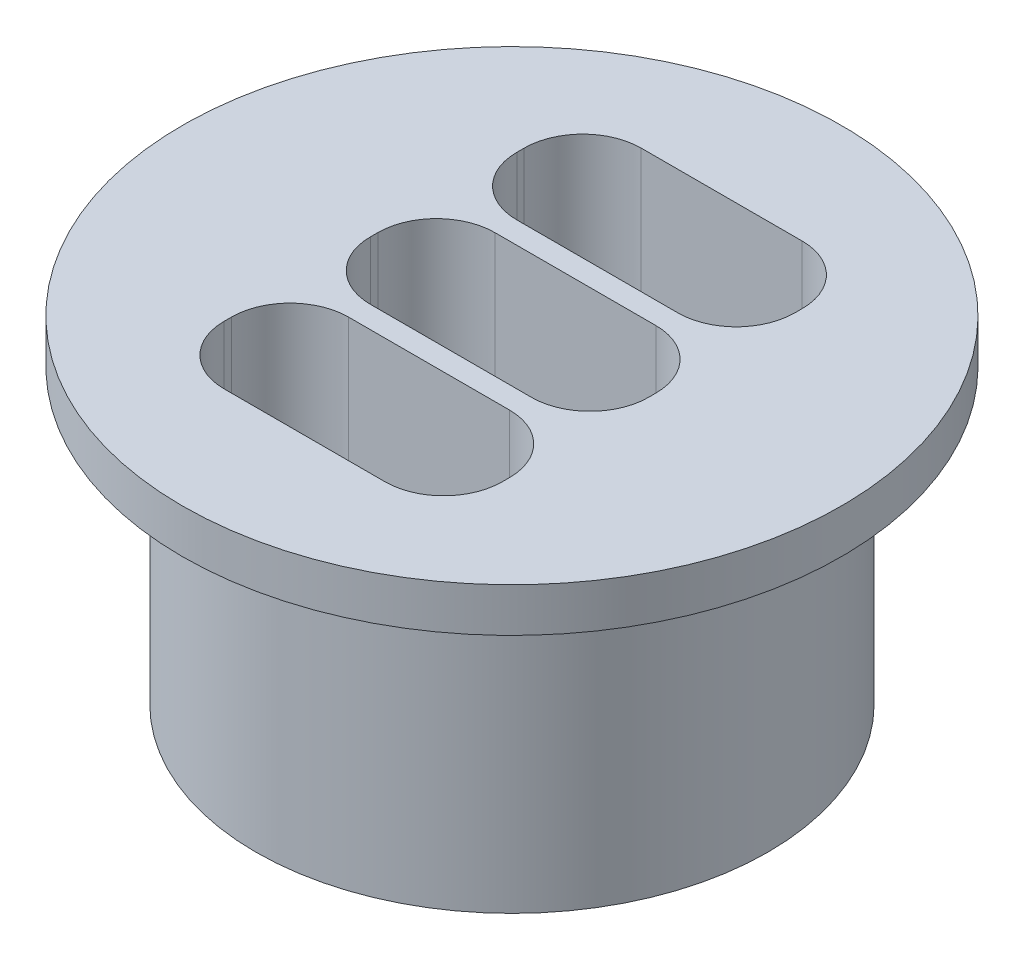
ISO-10303-21;
HEADER;
FILE_DESCRIPTION(('STEP AP214'),'2;1');
FILE_NAME('part.step','',(''),(''),'','','');
FILE_SCHEMA(('AUTOMOTIVE_DESIGN { 1 0 10303 214 1 1 1 1 }'));
ENDSEC;
DATA;
#1=APPLICATION_CONTEXT('core data for automotive mechanical design processes');
#2=APPLICATION_PROTOCOL_DEFINITION('international standard','automotive_design',2000,#1);
#3=PRODUCT_CONTEXT('',#1,'mechanical');
#4=PRODUCT('Part','Part','',(#3));
#5=PRODUCT_RELATED_PRODUCT_CATEGORY('part','',(#4));
#6=PRODUCT_DEFINITION_FORMATION('','',#4);
#7=PRODUCT_DEFINITION_CONTEXT('part definition',#1,'design');
#8=PRODUCT_DEFINITION('design','',#6,#7);
#9=PRODUCT_DEFINITION_SHAPE('','',#8);
#10=(LENGTH_UNIT() NAMED_UNIT(*) SI_UNIT(.MILLI.,.METRE.));
#11=(NAMED_UNIT(*) PLANE_ANGLE_UNIT() SI_UNIT($,.RADIAN.));
#12=(NAMED_UNIT(*) SI_UNIT($,.STERADIAN.) SOLID_ANGLE_UNIT());
#13=UNCERTAINTY_MEASURE_WITH_UNIT(LENGTH_MEASURE(1.E-05),#10,'distance_accuracy_value','');
#14=(GEOMETRIC_REPRESENTATION_CONTEXT(3) GLOBAL_UNCERTAINTY_ASSIGNED_CONTEXT((#13)) GLOBAL_UNIT_ASSIGNED_CONTEXT((#10,
#11,#12)) REPRESENTATION_CONTEXT('',''));
#15=CARTESIAN_POINT('',(0.,0.,0.));
#16=DIRECTION('',(0.,0.,1.));
#17=DIRECTION('',(1.,0.,0.));
#18=AXIS2_PLACEMENT_3D('',#15,#16,#17);
#19=CARTESIAN_POINT('',(0.,20.,0.));
#20=DIRECTION('',(0.,-1.,0.));
#21=DIRECTION('',(0.,0.,-1.));
#22=AXIS2_PLACEMENT_3D('',#19,#20,#21);
#23=CYLINDRICAL_SURFACE('',#22,17.5);
#24=CARTESIAN_POINT('',(0.,20.,0.));
#25=DIRECTION('',(0.,1.,0.));
#26=DIRECTION('',(0.,0.,1.));
#27=AXIS2_PLACEMENT_3D('',#24,#25,#26);
#28=CIRCLE('',#27,17.5);
#29=CARTESIAN_POINT('',(0.,20.,17.5));
#30=VERTEX_POINT('',#29);
#31=EDGE_CURVE('E246',#30,#30,#28,.T.);
#32=ORIENTED_EDGE('',*,*,#31,.F.);
#33=EDGE_LOOP('',(#32));
#34=FACE_BOUND('',#33,.T.);
#35=CARTESIAN_POINT('',(0.,0.,0.));
#36=DIRECTION('',(0.,1.,0.));
#37=DIRECTION('',(0.,0.,1.));
#38=AXIS2_PLACEMENT_3D('',#35,#36,#37);
#39=CIRCLE('',#38,17.5);
#40=CARTESIAN_POINT('',(0.,0.,17.5));
#41=VERTEX_POINT('',#40);
#42=EDGE_CURVE('E250',#41,#41,#39,.T.);
#43=ORIENTED_EDGE('',*,*,#42,.T.);
#44=EDGE_LOOP('',(#43));
#45=FACE_BOUND('',#44,.T.);
#46=ADVANCED_FACE('F39',(#34,#45),#23,.T.);
#47=CARTESIAN_POINT('',(0.,0.,0.));
#48=DIRECTION('',(0.,1.,0.));
#49=DIRECTION('',(0.,0.,1.));
#50=AXIS2_PLACEMENT_3D('',#47,#48,#49);
#51=PLANE('',#50);
#52=DIRECTION('',(0.,0.,1.));
#53=VECTOR('',#52,1.);
#54=CARTESIAN_POINT('',(-9.5,0.,-14.3338110373272));
#55=LINE('',#54,#53);
#56=CARTESIAN_POINT('',(-9.5,0.,-10.3338110373272));
#57=VERTEX_POINT('',#56);
#58=CARTESIAN_POINT('',(-9.5,0.,-9.83381103732719));
#59=VERTEX_POINT('',#58);
#60=EDGE_CURVE('E421',#57,#59,#55,.T.);
#61=ORIENTED_EDGE('',*,*,#60,.T.);
#62=CARTESIAN_POINT('',(-5.5,0.,-9.83381103732719));
#63=DIRECTION('',(0.,1.,0.));
#64=DIRECTION('',(0.,0.,1.));
#65=AXIS2_PLACEMENT_3D('',#62,#63,#64);
#66=CIRCLE('',#65,4.);
#67=CARTESIAN_POINT('',(-5.5,0.,-5.83381103732719));
#68=VERTEX_POINT('',#67);
#69=EDGE_CURVE('E62',#59,#68,#66,.T.);
#70=ORIENTED_EDGE('',*,*,#69,.T.);
#71=DIRECTION('',(1.,0.,0.));
#72=VECTOR('',#71,1.);
#73=CARTESIAN_POINT('',(-9.5,0.,-5.83381103732719));
#74=LINE('',#73,#72);
#75=CARTESIAN_POINT('',(5.5,0.,-5.83381103732719));
#76=VERTEX_POINT('',#75);
#77=EDGE_CURVE('E254',#68,#76,#74,.T.);
#78=ORIENTED_EDGE('',*,*,#77,.T.);
#79=CARTESIAN_POINT('',(5.5,0.,-9.83381103732719));
#80=DIRECTION('',(0.,1.,0.));
#81=DIRECTION('',(0.,0.,1.));
#82=AXIS2_PLACEMENT_3D('',#79,#80,#81);
#83=CIRCLE('',#82,4.);
#84=CARTESIAN_POINT('',(9.5,0.,-9.83381103732719));
#85=VERTEX_POINT('',#84);
#86=EDGE_CURVE('E382',#76,#85,#83,.T.);
#87=ORIENTED_EDGE('',*,*,#86,.T.);
#88=DIRECTION('',(0.,0.,-1.));
#89=VECTOR('',#88,1.);
#90=CARTESIAN_POINT('',(9.5,0.,-14.3338110373272));
#91=LINE('',#90,#89);
#92=CARTESIAN_POINT('',(9.5,0.,-10.3338110373272));
#93=VERTEX_POINT('',#92);
#94=EDGE_CURVE('E416',#85,#93,#91,.T.);
#95=ORIENTED_EDGE('',*,*,#94,.T.);
#96=CARTESIAN_POINT('',(5.5,0.,-10.3338110373272));
#97=DIRECTION('',(0.,1.,0.));
#98=DIRECTION('',(0.,0.,1.));
#99=AXIS2_PLACEMENT_3D('',#96,#97,#98);
#100=CIRCLE('',#99,4.);
#101=CARTESIAN_POINT('',(5.5,0.,-14.3338110373272));
#102=VERTEX_POINT('',#101);
#103=EDGE_CURVE('E11',#93,#102,#100,.T.);
#104=ORIENTED_EDGE('',*,*,#103,.T.);
#105=DIRECTION('',(-1.,0.,0.));
#106=VECTOR('',#105,1.);
#107=CARTESIAN_POINT('',(-9.5,0.,-14.3338110373272));
#108=LINE('',#107,#106);
#109=CARTESIAN_POINT('',(-5.5,0.,-14.3338110373272));
#110=VERTEX_POINT('',#109);
#111=EDGE_CURVE('E414',#102,#110,#108,.T.);
#112=ORIENTED_EDGE('',*,*,#111,.T.);
#113=CARTESIAN_POINT('',(-5.5,0.,-10.3338110373272));
#114=DIRECTION('',(0.,1.,0.));
#115=DIRECTION('',(0.,0.,1.));
#116=AXIS2_PLACEMENT_3D('',#113,#114,#115);
#117=CIRCLE('',#116,4.);
#118=EDGE_CURVE('E376',#110,#57,#117,.T.);
#119=ORIENTED_EDGE('',*,*,#118,.T.);
#120=EDGE_LOOP('',(#61,#70,#78,#87,#95,#104,#112,#119));
#121=FACE_BOUND('',#120,.T.);
#122=DIRECTION('',(-1.,0.,0.));
#123=VECTOR('',#122,1.);
#124=CARTESIAN_POINT('',(-9.4999999999999,0.,-4.33381103732719));
#125=LINE('',#124,#123);
#126=CARTESIAN_POINT('',(5.50000000000011,0.,-4.33381103732719));
#127=VERTEX_POINT('',#126);
#128=CARTESIAN_POINT('',(-5.49999999999989,0.,-4.33381103732719));
#129=VERTEX_POINT('',#128);
#130=EDGE_CURVE('E449',#127,#129,#125,.T.);
#131=ORIENTED_EDGE('',*,*,#130,.T.);
#132=CARTESIAN_POINT('',(-5.49999999999989,0.,-0.333811037327188));
#133=DIRECTION('',(0.,1.,0.));
#134=DIRECTION('',(0.,0.,1.));
#135=AXIS2_PLACEMENT_3D('',#132,#133,#134);
#136=CIRCLE('',#135,4.);
#137=CARTESIAN_POINT('',(-9.49999999999989,0.,-0.333811037327186));
#138=VERTEX_POINT('',#137);
#139=EDGE_CURVE('E337',#129,#138,#136,.T.);
#140=ORIENTED_EDGE('',*,*,#139,.T.);
#141=DIRECTION('',(0.,0.,1.));
#142=VECTOR('',#141,1.);
#143=CARTESIAN_POINT('',(-9.4999999999999,0.,-4.33381103732719));
#144=LINE('',#143,#142);
#145=CARTESIAN_POINT('',(-9.49999999999989,0.,0.166188962672814));
#146=VERTEX_POINT('',#145);
#147=EDGE_CURVE('E407',#138,#146,#144,.T.);
#148=ORIENTED_EDGE('',*,*,#147,.T.);
#149=CARTESIAN_POINT('',(-5.49999999999989,0.,0.166188962672812));
#150=DIRECTION('',(0.,1.,0.));
#151=DIRECTION('',(0.,0.,1.));
#152=AXIS2_PLACEMENT_3D('',#149,#150,#151);
#153=CIRCLE('',#152,4.);
#154=CARTESIAN_POINT('',(-5.49999999999989,0.,4.16618896267281));
#155=VERTEX_POINT('',#154);
#156=EDGE_CURVE('E331',#146,#155,#153,.T.);
#157=ORIENTED_EDGE('',*,*,#156,.T.);
#158=DIRECTION('',(1.,0.,0.));
#159=VECTOR('',#158,1.);
#160=CARTESIAN_POINT('',(-9.49999999999989,0.,4.16618896267281));
#161=LINE('',#160,#159);
#162=CARTESIAN_POINT('',(5.50000000000011,0.,4.16618896267281));
#163=VERTEX_POINT('',#162);
#164=EDGE_CURVE('E440',#155,#163,#161,.T.);
#165=ORIENTED_EDGE('',*,*,#164,.T.);
#166=CARTESIAN_POINT('',(5.50000000000011,0.,0.166188962672812));
#167=DIRECTION('',(0.,1.,0.));
#168=DIRECTION('',(0.,0.,1.));
#169=AXIS2_PLACEMENT_3D('',#166,#167,#168);
#170=CIRCLE('',#169,4.);
#171=CARTESIAN_POINT('',(9.5000000000001,0.,0.166188962672811));
#172=VERTEX_POINT('',#171);
#173=EDGE_CURVE('E325',#163,#172,#170,.T.);
#174=ORIENTED_EDGE('',*,*,#173,.T.);
#175=DIRECTION('',(0.,0.,-1.));
#176=VECTOR('',#175,1.);
#177=CARTESIAN_POINT('',(9.5000000000001,0.,-4.33381103732719));
#178=LINE('',#177,#176);
#179=CARTESIAN_POINT('',(9.5000000000001,0.,-0.33381103732719));
#180=VERTEX_POINT('',#179);
#181=EDGE_CURVE('E444',#172,#180,#178,.T.);
#182=ORIENTED_EDGE('',*,*,#181,.T.);
#183=CARTESIAN_POINT('',(5.50000000000011,0.,-0.333811037327188));
#184=DIRECTION('',(0.,1.,0.));
#185=DIRECTION('',(0.,0.,1.));
#186=AXIS2_PLACEMENT_3D('',#183,#184,#185);
#187=CIRCLE('',#186,4.);
#188=EDGE_CURVE('E343',#180,#127,#187,.T.);
#189=ORIENTED_EDGE('',*,*,#188,.T.);
#190=EDGE_LOOP('',(#131,#140,#148,#157,#165,#174,#182,#189));
#191=FACE_BOUND('',#190,.T.);
#192=DIRECTION('',(-1.,0.,0.));
#193=VECTOR('',#192,1.);
#194=CARTESIAN_POINT('',(-9.49999999999979,0.,5.66618896267281));
#195=LINE('',#194,#193);
#196=CARTESIAN_POINT('',(5.50000000000021,0.,5.66618896267281));
#197=VERTEX_POINT('',#196);
#198=CARTESIAN_POINT('',(-5.49999999999979,0.,5.66618896267281));
#199=VERTEX_POINT('',#198);
#200=EDGE_CURVE('E223',#197,#199,#195,.T.);
#201=ORIENTED_EDGE('',*,*,#200,.T.);
#202=CARTESIAN_POINT('',(-5.49999999999979,0.,9.66618896267281));
#203=DIRECTION('',(0.,1.,0.));
#204=DIRECTION('',(0.,0.,1.));
#205=AXIS2_PLACEMENT_3D('',#202,#203,#204);
#206=CIRCLE('',#205,4.);
#207=CARTESIAN_POINT('',(-9.49999999999979,0.,9.66618896267281));
#208=VERTEX_POINT('',#207);
#209=EDGE_CURVE('E313',#199,#208,#206,.T.);
#210=ORIENTED_EDGE('',*,*,#209,.T.);
#211=DIRECTION('',(0.,0.,1.));
#212=VECTOR('',#211,1.);
#213=CARTESIAN_POINT('',(-9.49999999999979,0.,5.66618896267281));
#214=LINE('',#213,#212);
#215=CARTESIAN_POINT('',(-9.49999999999979,0.,10.1661889626728));
#216=VERTEX_POINT('',#215);
#217=EDGE_CURVE('E461',#208,#216,#214,.T.);
#218=ORIENTED_EDGE('',*,*,#217,.T.);
#219=CARTESIAN_POINT('',(-5.49999999999979,0.,10.1661889626728));
#220=DIRECTION('',(0.,1.,0.));
#221=DIRECTION('',(0.,0.,1.));
#222=AXIS2_PLACEMENT_3D('',#219,#220,#221);
#223=CIRCLE('',#222,4.);
#224=CARTESIAN_POINT('',(-5.49999999999979,0.,14.1661889626728));
#225=VERTEX_POINT('',#224);
#226=EDGE_CURVE('E308',#216,#225,#223,.T.);
#227=ORIENTED_EDGE('',*,*,#226,.T.);
#228=DIRECTION('',(1.,0.,0.));
#229=VECTOR('',#228,1.);
#230=CARTESIAN_POINT('',(-9.49999999999979,0.,14.1661889626728));
#231=LINE('',#230,#229);
#232=CARTESIAN_POINT('',(5.50000000000021,0.,14.1661889626728));
#233=VERTEX_POINT('',#232);
#234=EDGE_CURVE('E240',#225,#233,#231,.T.);
#235=ORIENTED_EDGE('',*,*,#234,.T.);
#236=CARTESIAN_POINT('',(5.50000000000021,0.,10.1661889626728));
#237=DIRECTION('',(0.,1.,0.));
#238=DIRECTION('',(0.,0.,1.));
#239=AXIS2_PLACEMENT_3D('',#236,#237,#238);
#240=CIRCLE('',#239,4.);
#241=CARTESIAN_POINT('',(9.50000000000021,0.,10.1661889626728));
#242=VERTEX_POINT('',#241);
#243=EDGE_CURVE('E319',#233,#242,#240,.T.);
#244=ORIENTED_EDGE('',*,*,#243,.T.);
#245=DIRECTION('',(0.,0.,-1.));
#246=VECTOR('',#245,1.);
#247=CARTESIAN_POINT('',(9.50000000000021,0.,5.66618896267281));
#248=LINE('',#247,#246);
#249=CARTESIAN_POINT('',(9.50000000000021,0.,9.66618896267281));
#250=VERTEX_POINT('',#249);
#251=EDGE_CURVE('E475',#242,#250,#248,.T.);
#252=ORIENTED_EDGE('',*,*,#251,.T.);
#253=CARTESIAN_POINT('',(5.50000000000021,0.,9.66618896267281));
#254=DIRECTION('',(0.,1.,0.));
#255=DIRECTION('',(0.,0.,1.));
#256=AXIS2_PLACEMENT_3D('',#253,#254,#255);
#257=CIRCLE('',#256,4.);
#258=EDGE_CURVE('E213',#250,#197,#257,.T.);
#259=ORIENTED_EDGE('',*,*,#258,.T.);
#260=EDGE_LOOP('',(#201,#210,#218,#227,#235,#244,#252,#259));
#261=FACE_BOUND('',#260,.T.);
#262=ORIENTED_EDGE('',*,*,#42,.F.);
#263=EDGE_LOOP('',(#262));
#264=FACE_BOUND('',#263,.T.);
#265=ADVANCED_FACE('F412',(#121,#191,#261,#264),#51,.F.);
#266=CARTESIAN_POINT('',(0.,23.,0.));
#267=DIRECTION('',(0.,1.,0.));
#268=DIRECTION('',(0.,0.,1.));
#269=AXIS2_PLACEMENT_3D('',#266,#267,#268);
#270=PLANE('',#269);
#271=DIRECTION('',(0.,0.,-1.));
#272=VECTOR('',#271,1.);
#273=CARTESIAN_POINT('',(9.5,23.,-14.3338110373272));
#274=LINE('',#273,#272);
#275=CARTESIAN_POINT('',(9.5,23.,-9.83381103732719));
#276=VERTEX_POINT('',#275);
#277=CARTESIAN_POINT('',(9.5,23.,-10.3338110373272));
#278=VERTEX_POINT('',#277);
#279=EDGE_CURVE('E395',#276,#278,#274,.T.);
#280=ORIENTED_EDGE('',*,*,#279,.F.);
#281=CARTESIAN_POINT('',(5.5,23.,-9.83381103732719));
#282=DIRECTION('',(0.,1.,0.));
#283=DIRECTION('',(0.,0.,1.));
#284=AXIS2_PLACEMENT_3D('',#281,#282,#283);
#285=CIRCLE('',#284,4.);
#286=CARTESIAN_POINT('',(5.5,23.,-5.83381103732719));
#287=VERTEX_POINT('',#286);
#288=EDGE_CURVE('E379',#276,#287,#285,.F.);
#289=ORIENTED_EDGE('',*,*,#288,.T.);
#290=DIRECTION('',(1.,0.,0.));
#291=VECTOR('',#290,1.);
#292=CARTESIAN_POINT('',(-9.5,23.,-5.83381103732719));
#293=LINE('',#292,#291);
#294=CARTESIAN_POINT('',(-5.5,23.,-5.83381103732719));
#295=VERTEX_POINT('',#294);
#296=EDGE_CURVE('E426',#295,#287,#293,.T.);
#297=ORIENTED_EDGE('',*,*,#296,.F.);
#298=CARTESIAN_POINT('',(-5.5,23.,-9.83381103732719));
#299=DIRECTION('',(0.,1.,0.));
#300=DIRECTION('',(0.,0.,1.));
#301=AXIS2_PLACEMENT_3D('',#298,#299,#300);
#302=CIRCLE('',#301,4.);
#303=CARTESIAN_POINT('',(-9.5,23.,-9.83381103732719));
#304=VERTEX_POINT('',#303);
#305=EDGE_CURVE('E385',#295,#304,#302,.F.);
#306=ORIENTED_EDGE('',*,*,#305,.T.);
#307=DIRECTION('',(0.,0.,1.));
#308=VECTOR('',#307,1.);
#309=CARTESIAN_POINT('',(-9.5,23.,-14.3338110373272));
#310=LINE('',#309,#308);
#311=CARTESIAN_POINT('',(-9.5,23.,-10.3338110373272));
#312=VERTEX_POINT('',#311);
#313=EDGE_CURVE('E434',#312,#304,#310,.T.);
#314=ORIENTED_EDGE('',*,*,#313,.F.);
#315=CARTESIAN_POINT('',(-5.5,23.,-10.3338110373272));
#316=DIRECTION('',(0.,1.,0.));
#317=DIRECTION('',(0.,0.,1.));
#318=AXIS2_PLACEMENT_3D('',#315,#316,#317);
#319=CIRCLE('',#318,4.);
#320=CARTESIAN_POINT('',(-5.5,23.,-14.3338110373272));
#321=VERTEX_POINT('',#320);
#322=EDGE_CURVE('E373',#312,#321,#319,.F.);
#323=ORIENTED_EDGE('',*,*,#322,.T.);
#324=DIRECTION('',(-1.,0.,0.));
#325=VECTOR('',#324,1.);
#326=CARTESIAN_POINT('',(-9.5,23.,-14.3338110373272));
#327=LINE('',#326,#325);
#328=CARTESIAN_POINT('',(5.5,23.,-14.3338110373272));
#329=VERTEX_POINT('',#328);
#330=EDGE_CURVE('E397',#329,#321,#327,.T.);
#331=ORIENTED_EDGE('',*,*,#330,.F.);
#332=CARTESIAN_POINT('',(5.5,23.,-10.3338110373272));
#333=DIRECTION('',(0.,1.,0.));
#334=DIRECTION('',(0.,0.,1.));
#335=AXIS2_PLACEMENT_3D('',#332,#333,#334);
#336=CIRCLE('',#335,4.);
#337=EDGE_CURVE('E48',#329,#278,#336,.F.);
#338=ORIENTED_EDGE('',*,*,#337,.T.);
#339=EDGE_LOOP('',(#280,#289,#297,#306,#314,#323,#331,#338));
#340=FACE_BOUND('',#339,.T.);
#341=DIRECTION('',(1.,0.,0.));
#342=VECTOR('',#341,1.);
#343=CARTESIAN_POINT('',(-9.49999999999989,23.,4.16618896267281));
#344=LINE('',#343,#342);
#345=CARTESIAN_POINT('',(-5.49999999999989,23.,4.16618896267281));
#346=VERTEX_POINT('',#345);
#347=CARTESIAN_POINT('',(5.50000000000011,23.,4.16618896267281));
#348=VERTEX_POINT('',#347);
#349=EDGE_CURVE('E456',#346,#348,#344,.T.);
#350=ORIENTED_EDGE('',*,*,#349,.F.);
#351=CARTESIAN_POINT('',(-5.49999999999989,23.,0.166188962672812));
#352=DIRECTION('',(0.,1.,0.));
#353=DIRECTION('',(0.,0.,1.));
#354=AXIS2_PLACEMENT_3D('',#351,#352,#353);
#355=CIRCLE('',#354,4.);
#356=CARTESIAN_POINT('',(-9.49999999999989,23.,0.166188962672814));
#357=VERTEX_POINT('',#356);
#358=EDGE_CURVE('E328',#346,#357,#355,.F.);
#359=ORIENTED_EDGE('',*,*,#358,.T.);
#360=DIRECTION('',(0.,0.,1.));
#361=VECTOR('',#360,1.);
#362=CARTESIAN_POINT('',(-9.4999999999999,23.,-4.33381103732719));
#363=LINE('',#362,#361);
#364=CARTESIAN_POINT('',(-9.49999999999989,23.,-0.333811037327186));
#365=VERTEX_POINT('',#364);
#366=EDGE_CURVE('E445',#365,#357,#363,.T.);
#367=ORIENTED_EDGE('',*,*,#366,.F.);
#368=CARTESIAN_POINT('',(-5.49999999999989,23.,-0.333811037327188));
#369=DIRECTION('',(0.,1.,0.));
#370=DIRECTION('',(0.,0.,1.));
#371=AXIS2_PLACEMENT_3D('',#368,#369,#370);
#372=CIRCLE('',#371,4.);
#373=CARTESIAN_POINT('',(-5.49999999999989,23.,-4.33381103732719));
#374=VERTEX_POINT('',#373);
#375=EDGE_CURVE('E334',#365,#374,#372,.F.);
#376=ORIENTED_EDGE('',*,*,#375,.T.);
#377=DIRECTION('',(-1.,0.,0.));
#378=VECTOR('',#377,1.);
#379=CARTESIAN_POINT('',(-9.4999999999999,23.,-4.33381103732719));
#380=LINE('',#379,#378);
#381=CARTESIAN_POINT('',(5.50000000000011,23.,-4.33381103732719));
#382=VERTEX_POINT('',#381);
#383=EDGE_CURVE('E465',#382,#374,#380,.T.);
#384=ORIENTED_EDGE('',*,*,#383,.F.);
#385=CARTESIAN_POINT('',(5.50000000000011,23.,-0.333811037327188));
#386=DIRECTION('',(0.,1.,0.));
#387=DIRECTION('',(0.,0.,1.));
#388=AXIS2_PLACEMENT_3D('',#385,#386,#387);
#389=CIRCLE('',#388,4.);
#390=CARTESIAN_POINT('',(9.5000000000001,23.,-0.33381103732719));
#391=VERTEX_POINT('',#390);
#392=EDGE_CURVE('E340',#382,#391,#389,.F.);
#393=ORIENTED_EDGE('',*,*,#392,.T.);
#394=DIRECTION('',(0.,0.,-1.));
#395=VECTOR('',#394,1.);
#396=CARTESIAN_POINT('',(9.5000000000001,23.,-4.33381103732719));
#397=LINE('',#396,#395);
#398=CARTESIAN_POINT('',(9.5000000000001,23.,0.166188962672811));
#399=VERTEX_POINT('',#398);
#400=EDGE_CURVE('E460',#399,#391,#397,.T.);
#401=ORIENTED_EDGE('',*,*,#400,.F.);
#402=CARTESIAN_POINT('',(5.50000000000011,23.,0.166188962672812));
#403=DIRECTION('',(0.,1.,0.));
#404=DIRECTION('',(0.,0.,1.));
#405=AXIS2_PLACEMENT_3D('',#402,#403,#404);
#406=CIRCLE('',#405,4.);
#407=EDGE_CURVE('E322',#399,#348,#406,.F.);
#408=ORIENTED_EDGE('',*,*,#407,.T.);
#409=EDGE_LOOP('',(#350,#359,#367,#376,#384,#393,#401,#408));
#410=FACE_BOUND('',#409,.T.);
#411=DIRECTION('',(1.,0.,0.));
#412=VECTOR('',#411,1.);
#413=CARTESIAN_POINT('',(-9.49999999999979,23.,14.1661889626728));
#414=LINE('',#413,#412);
#415=CARTESIAN_POINT('',(-5.49999999999979,23.,14.1661889626728));
#416=VERTEX_POINT('',#415);
#417=CARTESIAN_POINT('',(5.50000000000021,23.,14.1661889626728));
#418=VERTEX_POINT('',#417);
#419=EDGE_CURVE('E242',#416,#418,#414,.T.);
#420=ORIENTED_EDGE('',*,*,#419,.F.);
#421=CARTESIAN_POINT('',(-5.49999999999979,23.,10.1661889626728));
#422=DIRECTION('',(0.,1.,0.));
#423=DIRECTION('',(0.,0.,1.));
#424=AXIS2_PLACEMENT_3D('',#421,#422,#423);
#425=CIRCLE('',#424,4.);
#426=CARTESIAN_POINT('',(-9.49999999999979,23.,10.1661889626728));
#427=VERTEX_POINT('',#426);
#428=EDGE_CURVE('E305',#416,#427,#425,.F.);
#429=ORIENTED_EDGE('',*,*,#428,.T.);
#430=DIRECTION('',(0.,0.,1.));
#431=VECTOR('',#430,1.);
#432=CARTESIAN_POINT('',(-9.49999999999979,23.,5.66618896267281));
#433=LINE('',#432,#431);
#434=CARTESIAN_POINT('',(-9.49999999999979,23.,9.66618896267281));
#435=VERTEX_POINT('',#434);
#436=EDGE_CURVE('E234',#435,#427,#433,.T.);
#437=ORIENTED_EDGE('',*,*,#436,.F.);
#438=CARTESIAN_POINT('',(-5.49999999999979,23.,9.66618896267281));
#439=DIRECTION('',(0.,1.,0.));
#440=DIRECTION('',(0.,0.,1.));
#441=AXIS2_PLACEMENT_3D('',#438,#439,#440);
#442=CIRCLE('',#441,4.);
#443=CARTESIAN_POINT('',(-5.49999999999979,23.,5.66618896267281));
#444=VERTEX_POINT('',#443);
#445=EDGE_CURVE('E232',#435,#444,#442,.F.);
#446=ORIENTED_EDGE('',*,*,#445,.T.);
#447=DIRECTION('',(-1.,0.,0.));
#448=VECTOR('',#447,1.);
#449=CARTESIAN_POINT('',(-9.49999999999979,23.,5.66618896267281));
#450=LINE('',#449,#448);
#451=CARTESIAN_POINT('',(5.50000000000021,23.,5.66618896267281));
#452=VERTEX_POINT('',#451);
#453=EDGE_CURVE('E220',#452,#444,#450,.T.);
#454=ORIENTED_EDGE('',*,*,#453,.F.);
#455=CARTESIAN_POINT('',(5.50000000000021,23.,9.66618896267281));
#456=DIRECTION('',(0.,1.,0.));
#457=DIRECTION('',(0.,0.,1.));
#458=AXIS2_PLACEMENT_3D('',#455,#456,#457);
#459=CIRCLE('',#458,4.);
#460=CARTESIAN_POINT('',(9.50000000000021,23.,9.66618896267281));
#461=VERTEX_POINT('',#460);
#462=EDGE_CURVE('E202',#452,#461,#459,.F.);
#463=ORIENTED_EDGE('',*,*,#462,.T.);
#464=DIRECTION('',(0.,0.,-1.));
#465=VECTOR('',#464,1.);
#466=CARTESIAN_POINT('',(9.50000000000021,23.,5.66618896267281));
#467=LINE('',#466,#465);
#468=CARTESIAN_POINT('',(9.50000000000021,23.,10.1661889626728));
#469=VERTEX_POINT('',#468);
#470=EDGE_CURVE('E235',#469,#461,#467,.T.);
#471=ORIENTED_EDGE('',*,*,#470,.F.);
#472=CARTESIAN_POINT('',(5.50000000000021,23.,10.1661889626728));
#473=DIRECTION('',(0.,1.,0.));
#474=DIRECTION('',(0.,0.,1.));
#475=AXIS2_PLACEMENT_3D('',#472,#473,#474);
#476=CIRCLE('',#475,4.);
#477=EDGE_CURVE('E316',#469,#418,#476,.F.);
#478=ORIENTED_EDGE('',*,*,#477,.T.);
#479=EDGE_LOOP('',(#420,#429,#437,#446,#454,#463,#471,#478));
#480=FACE_BOUND('',#479,.T.);
#481=CARTESIAN_POINT('',(0.,23.,0.));
#482=DIRECTION('',(0.,1.,0.));
#483=DIRECTION('',(0.,0.,1.));
#484=AXIS2_PLACEMENT_3D('',#481,#482,#483);
#485=CIRCLE('',#484,22.5207709348988);
#486=CARTESIAN_POINT('',(0.,23.,22.5207709348988));
#487=VERTEX_POINT('',#486);
#488=EDGE_CURVE('E490',#487,#487,#485,.T.);
#489=ORIENTED_EDGE('',*,*,#488,.T.);
#490=EDGE_LOOP('',(#489));
#491=FACE_BOUND('',#490,.T.);
#492=ADVANCED_FACE('F229',(#340,#410,#480,#491),#270,.T.);
#493=CARTESIAN_POINT('',(0.,20.,0.));
#494=DIRECTION('',(0.,1.,0.));
#495=DIRECTION('',(0.,0.,1.));
#496=AXIS2_PLACEMENT_3D('',#493,#494,#495);
#497=PLANE('',#496);
#498=ORIENTED_EDGE('',*,*,#31,.T.);
#499=EDGE_LOOP('',(#498));
#500=FACE_BOUND('',#499,.T.);
#501=CARTESIAN_POINT('',(0.,20.,0.));
#502=DIRECTION('',(0.,1.,0.));
#503=DIRECTION('',(0.,0.,1.));
#504=AXIS2_PLACEMENT_3D('',#501,#502,#503);
#505=CIRCLE('',#504,22.5207709348988);
#506=CARTESIAN_POINT('',(0.,20.,22.5207709348988));
#507=VERTEX_POINT('',#506);
#508=EDGE_CURVE('E485',#507,#507,#505,.T.);
#509=ORIENTED_EDGE('',*,*,#508,.F.);
#510=EDGE_LOOP('',(#509));
#511=FACE_BOUND('',#510,.T.);
#512=ADVANCED_FACE('F607',(#500,#511),#497,.F.);
#513=CARTESIAN_POINT('',(-9.49999999999979,0.,14.1661889626728));
#514=DIRECTION('',(0.,0.,1.));
#515=DIRECTION('',(1.,0.,0.));
#516=AXIS2_PLACEMENT_3D('',#513,#514,#515);
#517=PLANE('',#516);
#518=ORIENTED_EDGE('',*,*,#234,.F.);
#519=DIRECTION('',(0.,1.,0.));
#520=VECTOR('',#519,1.);
#521=CARTESIAN_POINT('',(-5.49999999999979,23.,14.1661889626728));
#522=LINE('',#521,#520);
#523=EDGE_CURVE('E265',#225,#416,#522,.T.);
#524=ORIENTED_EDGE('',*,*,#523,.T.);
#525=ORIENTED_EDGE('',*,*,#419,.T.);
#526=DIRECTION('',(0.,1.,0.));
#527=VECTOR('',#526,1.);
#528=CARTESIAN_POINT('',(5.50000000000021,0.,14.1661889626728));
#529=LINE('',#528,#527);
#530=EDGE_CURVE('E262',#418,#233,#529,.F.);
#531=ORIENTED_EDGE('',*,*,#530,.T.);
#532=EDGE_LOOP('',(#518,#524,#525,#531));
#533=FACE_BOUND('',#532,.T.);
#534=ADVANCED_FACE('F598',(#533),#517,.F.);
#535=CARTESIAN_POINT('',(-9.49999999999979,0.,5.66618896267281));
#536=DIRECTION('',(-1.,0.,0.));
#537=DIRECTION('',(0.,0.,1.));
#538=AXIS2_PLACEMENT_3D('',#535,#536,#537);
#539=PLANE('',#538);
#540=ORIENTED_EDGE('',*,*,#436,.T.);
#541=DIRECTION('',(0.,1.,0.));
#542=VECTOR('',#541,1.);
#543=CARTESIAN_POINT('',(-9.49999999999979,0.,10.1661889626728));
#544=LINE('',#543,#542);
#545=EDGE_CURVE('E273',#427,#216,#544,.F.);
#546=ORIENTED_EDGE('',*,*,#545,.T.);
#547=ORIENTED_EDGE('',*,*,#217,.F.);
#548=DIRECTION('',(0.,1.,0.));
#549=VECTOR('',#548,1.);
#550=CARTESIAN_POINT('',(-9.49999999999979,23.,9.66618896267281));
#551=LINE('',#550,#549);
#552=EDGE_CURVE('E269',#208,#435,#551,.T.);
#553=ORIENTED_EDGE('',*,*,#552,.T.);
#554=EDGE_LOOP('',(#540,#546,#547,#553));
#555=FACE_BOUND('',#554,.T.);
#556=ADVANCED_FACE('F595',(#555),#539,.F.);
#557=CARTESIAN_POINT('',(-9.49999999999979,0.,5.66618896267281));
#558=DIRECTION('',(0.,0.,-1.));
#559=DIRECTION('',(-1.,0.,0.));
#560=AXIS2_PLACEMENT_3D('',#557,#558,#559);
#561=PLANE('',#560);
#562=ORIENTED_EDGE('',*,*,#200,.F.);
#563=DIRECTION('',(0.,1.,0.));
#564=VECTOR('',#563,1.);
#565=CARTESIAN_POINT('',(5.50000000000021,23.,5.66618896267281));
#566=LINE('',#565,#564);
#567=EDGE_CURVE('E206',#197,#452,#566,.T.);
#568=ORIENTED_EDGE('',*,*,#567,.T.);
#569=ORIENTED_EDGE('',*,*,#453,.T.);
#570=DIRECTION('',(0.,1.,0.));
#571=VECTOR('',#570,1.);
#572=CARTESIAN_POINT('',(-5.49999999999979,0.,5.66618896267281));
#573=LINE('',#572,#571);
#574=EDGE_CURVE('E226',#444,#199,#573,.F.);
#575=ORIENTED_EDGE('',*,*,#574,.T.);
#576=EDGE_LOOP('',(#562,#568,#569,#575));
#577=FACE_BOUND('',#576,.T.);
#578=ADVANCED_FACE('F219',(#577),#561,.F.);
#579=CARTESIAN_POINT('',(9.50000000000021,0.,5.66618896267281));
#580=DIRECTION('',(1.,0.,0.));
#581=DIRECTION('',(0.,0.,-1.));
#582=AXIS2_PLACEMENT_3D('',#579,#580,#581);
#583=PLANE('',#582);
#584=ORIENTED_EDGE('',*,*,#470,.T.);
#585=DIRECTION('',(0.,1.,0.));
#586=VECTOR('',#585,1.);
#587=CARTESIAN_POINT('',(9.50000000000021,0.,9.66618896267281));
#588=LINE('',#587,#586);
#589=EDGE_CURVE('E207',#461,#250,#588,.F.);
#590=ORIENTED_EDGE('',*,*,#589,.T.);
#591=ORIENTED_EDGE('',*,*,#251,.F.);
#592=DIRECTION('',(0.,1.,0.));
#593=VECTOR('',#592,1.);
#594=CARTESIAN_POINT('',(9.50000000000021,23.,10.1661889626728));
#595=LINE('',#594,#593);
#596=EDGE_CURVE('E225',#242,#469,#595,.T.);
#597=ORIENTED_EDGE('',*,*,#596,.T.);
#598=EDGE_LOOP('',(#584,#590,#591,#597));
#599=FACE_BOUND('',#598,.T.);
#600=ADVANCED_FACE('F593',(#599),#583,.F.);
#601=CARTESIAN_POINT('',(-9.49999999999989,0.,4.16618896267281));
#602=DIRECTION('',(0.,0.,1.));
#603=DIRECTION('',(1.,0.,0.));
#604=AXIS2_PLACEMENT_3D('',#601,#602,#603);
#605=PLANE('',#604);
#606=ORIENTED_EDGE('',*,*,#349,.T.);
#607=DIRECTION('',(0.,1.,0.));
#608=VECTOR('',#607,1.);
#609=CARTESIAN_POINT('',(5.50000000000011,0.,4.16618896267281));
#610=LINE('',#609,#608);
#611=EDGE_CURVE('E287',#348,#163,#610,.F.);
#612=ORIENTED_EDGE('',*,*,#611,.T.);
#613=ORIENTED_EDGE('',*,*,#164,.F.);
#614=DIRECTION('',(0.,1.,0.));
#615=VECTOR('',#614,1.);
#616=CARTESIAN_POINT('',(-5.49999999999989,23.,4.16618896267281));
#617=LINE('',#616,#615);
#618=EDGE_CURVE('E283',#155,#346,#617,.T.);
#619=ORIENTED_EDGE('',*,*,#618,.T.);
#620=EDGE_LOOP('',(#606,#612,#613,#619));
#621=FACE_BOUND('',#620,.T.);
#622=ADVANCED_FACE('F583',(#621),#605,.F.);
#623=CARTESIAN_POINT('',(-9.4999999999999,0.,-4.33381103732719));
#624=DIRECTION('',(-1.,0.,0.));
#625=DIRECTION('',(0.,0.,1.));
#626=AXIS2_PLACEMENT_3D('',#623,#624,#625);
#627=PLANE('',#626);
#628=ORIENTED_EDGE('',*,*,#366,.T.);
#629=DIRECTION('',(0.,1.,0.));
#630=VECTOR('',#629,1.);
#631=CARTESIAN_POINT('',(-9.49999999999989,0.,0.166188962672814));
#632=LINE('',#631,#630);
#633=EDGE_CURVE('E294',#357,#146,#632,.F.);
#634=ORIENTED_EDGE('',*,*,#633,.T.);
#635=ORIENTED_EDGE('',*,*,#147,.F.);
#636=DIRECTION('',(0.,1.,0.));
#637=VECTOR('',#636,1.);
#638=CARTESIAN_POINT('',(-9.49999999999989,23.,-0.333811037327186));
#639=LINE('',#638,#637);
#640=EDGE_CURVE('E290',#138,#365,#639,.T.);
#641=ORIENTED_EDGE('',*,*,#640,.T.);
#642=EDGE_LOOP('',(#628,#634,#635,#641));
#643=FACE_BOUND('',#642,.T.);
#644=ADVANCED_FACE('F579',(#643),#627,.F.);
#645=CARTESIAN_POINT('',(-9.4999999999999,0.,-4.33381103732719));
#646=DIRECTION('',(0.,0.,-1.));
#647=DIRECTION('',(-1.,0.,0.));
#648=AXIS2_PLACEMENT_3D('',#645,#646,#647);
#649=PLANE('',#648);
#650=ORIENTED_EDGE('',*,*,#383,.T.);
#651=DIRECTION('',(0.,1.,0.));
#652=VECTOR('',#651,1.);
#653=CARTESIAN_POINT('',(-5.49999999999989,0.,-4.33381103732719));
#654=LINE('',#653,#652);
#655=EDGE_CURVE('E214',#374,#129,#654,.F.);
#656=ORIENTED_EDGE('',*,*,#655,.T.);
#657=ORIENTED_EDGE('',*,*,#130,.F.);
#658=DIRECTION('',(0.,1.,0.));
#659=VECTOR('',#658,1.);
#660=CARTESIAN_POINT('',(5.50000000000011,23.,-4.33381103732719));
#661=LINE('',#660,#659);
#662=EDGE_CURVE('E297',#127,#382,#661,.T.);
#663=ORIENTED_EDGE('',*,*,#662,.T.);
#664=EDGE_LOOP('',(#650,#656,#657,#663));
#665=FACE_BOUND('',#664,.T.);
#666=ADVANCED_FACE('F582',(#665),#649,.F.);
#667=CARTESIAN_POINT('',(9.5000000000001,0.,-4.33381103732719));
#668=DIRECTION('',(1.,0.,0.));
#669=DIRECTION('',(0.,0.,-1.));
#670=AXIS2_PLACEMENT_3D('',#667,#668,#669);
#671=PLANE('',#670);
#672=ORIENTED_EDGE('',*,*,#181,.F.);
#673=DIRECTION('',(0.,1.,0.));
#674=VECTOR('',#673,1.);
#675=CARTESIAN_POINT('',(9.5000000000001,23.,0.166188962672811));
#676=LINE('',#675,#674);
#677=EDGE_CURVE('E279',#172,#399,#676,.T.);
#678=ORIENTED_EDGE('',*,*,#677,.T.);
#679=ORIENTED_EDGE('',*,*,#400,.T.);
#680=DIRECTION('',(0.,1.,0.));
#681=VECTOR('',#680,1.);
#682=CARTESIAN_POINT('',(9.5000000000001,0.,-0.33381103732719));
#683=LINE('',#682,#681);
#684=EDGE_CURVE('E276',#391,#180,#683,.F.);
#685=ORIENTED_EDGE('',*,*,#684,.T.);
#686=EDGE_LOOP('',(#672,#678,#679,#685));
#687=FACE_BOUND('',#686,.T.);
#688=ADVANCED_FACE('F578',(#687),#671,.F.);
#689=CARTESIAN_POINT('',(9.5,0.,-14.3338110373272));
#690=DIRECTION('',(1.,0.,0.));
#691=DIRECTION('',(0.,0.,-1.));
#692=AXIS2_PLACEMENT_3D('',#689,#690,#691);
#693=PLANE('',#692);
#694=ORIENTED_EDGE('',*,*,#94,.F.);
#695=DIRECTION('',(0.,1.,0.));
#696=VECTOR('',#695,1.);
#697=CARTESIAN_POINT('',(9.5,23.,-9.83381103732719));
#698=LINE('',#697,#696);
#699=EDGE_CURVE('E363',#85,#276,#698,.T.);
#700=ORIENTED_EDGE('',*,*,#699,.T.);
#701=ORIENTED_EDGE('',*,*,#279,.T.);
#702=DIRECTION('',(0.,1.,0.));
#703=VECTOR('',#702,1.);
#704=CARTESIAN_POINT('',(9.5,0.,-10.3338110373272));
#705=LINE('',#704,#703);
#706=EDGE_CURVE('E360',#278,#93,#705,.F.);
#707=ORIENTED_EDGE('',*,*,#706,.T.);
#708=EDGE_LOOP('',(#694,#700,#701,#707));
#709=FACE_BOUND('',#708,.T.);
#710=ADVANCED_FACE('F403',(#709),#693,.F.);
#711=CARTESIAN_POINT('',(-9.5,0.,-5.83381103732719));
#712=DIRECTION('',(0.,0.,1.));
#713=DIRECTION('',(1.,0.,0.));
#714=AXIS2_PLACEMENT_3D('',#711,#712,#713);
#715=PLANE('',#714);
#716=ORIENTED_EDGE('',*,*,#296,.T.);
#717=DIRECTION('',(0.,1.,0.));
#718=VECTOR('',#717,1.);
#719=CARTESIAN_POINT('',(5.5,0.,-5.83381103732719));
#720=LINE('',#719,#718);
#721=EDGE_CURVE('E55',#287,#76,#720,.F.);
#722=ORIENTED_EDGE('',*,*,#721,.T.);
#723=ORIENTED_EDGE('',*,*,#77,.F.);
#724=DIRECTION('',(0.,1.,0.));
#725=VECTOR('',#724,1.);
#726=CARTESIAN_POINT('',(-5.5,23.,-5.83381103732719));
#727=LINE('',#726,#725);
#728=EDGE_CURVE('E367',#68,#295,#727,.T.);
#729=ORIENTED_EDGE('',*,*,#728,.T.);
#730=EDGE_LOOP('',(#716,#722,#723,#729));
#731=FACE_BOUND('',#730,.T.);
#732=ADVANCED_FACE('F561',(#731),#715,.F.);
#733=CARTESIAN_POINT('',(-9.5,0.,-14.3338110373272));
#734=DIRECTION('',(-1.,0.,0.));
#735=DIRECTION('',(0.,0.,1.));
#736=AXIS2_PLACEMENT_3D('',#733,#734,#735);
#737=PLANE('',#736);
#738=ORIENTED_EDGE('',*,*,#60,.F.);
#739=DIRECTION('',(0.,1.,0.));
#740=VECTOR('',#739,1.);
#741=CARTESIAN_POINT('',(-9.5,23.,-10.3338110373272));
#742=LINE('',#741,#740);
#743=EDGE_CURVE('E349',#57,#312,#742,.T.);
#744=ORIENTED_EDGE('',*,*,#743,.T.);
#745=ORIENTED_EDGE('',*,*,#313,.T.);
#746=DIRECTION('',(0.,1.,0.));
#747=VECTOR('',#746,1.);
#748=CARTESIAN_POINT('',(-9.5,0.,-9.83381103732719));
#749=LINE('',#748,#747);
#750=EDGE_CURVE('E346',#304,#59,#749,.F.);
#751=ORIENTED_EDGE('',*,*,#750,.T.);
#752=EDGE_LOOP('',(#738,#744,#745,#751));
#753=FACE_BOUND('',#752,.T.);
#754=ADVANCED_FACE('F566',(#753),#737,.F.);
#755=CARTESIAN_POINT('',(-9.5,0.,-14.3338110373272));
#756=DIRECTION('',(0.,0.,-1.));
#757=DIRECTION('',(-1.,0.,0.));
#758=AXIS2_PLACEMENT_3D('',#755,#756,#757);
#759=PLANE('',#758);
#760=ORIENTED_EDGE('',*,*,#330,.T.);
#761=DIRECTION('',(0.,1.,0.));
#762=VECTOR('',#761,1.);
#763=CARTESIAN_POINT('',(-5.5,0.,-14.3338110373272));
#764=LINE('',#763,#762);
#765=EDGE_CURVE('E357',#321,#110,#764,.F.);
#766=ORIENTED_EDGE('',*,*,#765,.T.);
#767=ORIENTED_EDGE('',*,*,#111,.F.);
#768=DIRECTION('',(0.,1.,0.));
#769=VECTOR('',#768,1.);
#770=CARTESIAN_POINT('',(5.5,23.,-14.3338110373272));
#771=LINE('',#770,#769);
#772=EDGE_CURVE('E353',#102,#329,#771,.T.);
#773=ORIENTED_EDGE('',*,*,#772,.T.);
#774=EDGE_LOOP('',(#760,#766,#767,#773));
#775=FACE_BOUND('',#774,.T.);
#776=ADVANCED_FACE('F418',(#775),#759,.F.);
#777=CARTESIAN_POINT('',(5.50000000000021,0.,9.66618896267281));
#778=DIRECTION('',(0.,-1.,0.));
#779=DIRECTION('',(0.,0.,-1.));
#780=AXIS2_PLACEMENT_3D('',#777,#778,#779);
#781=CYLINDRICAL_SURFACE('',#780,4.);
#782=ORIENTED_EDGE('',*,*,#258,.F.);
#783=ORIENTED_EDGE('',*,*,#589,.F.);
#784=ORIENTED_EDGE('',*,*,#462,.F.);
#785=ORIENTED_EDGE('',*,*,#567,.F.);
#786=EDGE_LOOP('',(#782,#783,#784,#785));
#787=FACE_BOUND('',#786,.T.);
#788=ADVANCED_FACE('F205',(#787),#781,.F.);
#789=CARTESIAN_POINT('',(-5.49999999999979,0.,10.1661889626728));
#790=DIRECTION('',(0.,-1.,0.));
#791=DIRECTION('',(0.,0.,-1.));
#792=AXIS2_PLACEMENT_3D('',#789,#790,#791);
#793=CYLINDRICAL_SURFACE('',#792,4.);
#794=ORIENTED_EDGE('',*,*,#226,.F.);
#795=ORIENTED_EDGE('',*,*,#545,.F.);
#796=ORIENTED_EDGE('',*,*,#428,.F.);
#797=ORIENTED_EDGE('',*,*,#523,.F.);
#798=EDGE_LOOP('',(#794,#795,#796,#797));
#799=FACE_BOUND('',#798,.T.);
#800=ADVANCED_FACE('F519',(#799),#793,.F.);
#801=CARTESIAN_POINT('',(-5.49999999999979,0.,9.66618896267281));
#802=DIRECTION('',(0.,-1.,0.));
#803=DIRECTION('',(0.,0.,-1.));
#804=AXIS2_PLACEMENT_3D('',#801,#802,#803);
#805=CYLINDRICAL_SURFACE('',#804,4.);
#806=ORIENTED_EDGE('',*,*,#209,.F.);
#807=ORIENTED_EDGE('',*,*,#574,.F.);
#808=ORIENTED_EDGE('',*,*,#445,.F.);
#809=ORIENTED_EDGE('',*,*,#552,.F.);
#810=EDGE_LOOP('',(#806,#807,#808,#809));
#811=FACE_BOUND('',#810,.T.);
#812=ADVANCED_FACE('F522',(#811),#805,.F.);
#813=CARTESIAN_POINT('',(5.50000000000021,0.,10.1661889626728));
#814=DIRECTION('',(0.,-1.,0.));
#815=DIRECTION('',(0.,0.,-1.));
#816=AXIS2_PLACEMENT_3D('',#813,#814,#815);
#817=CYLINDRICAL_SURFACE('',#816,4.);
#818=ORIENTED_EDGE('',*,*,#243,.F.);
#819=ORIENTED_EDGE('',*,*,#530,.F.);
#820=ORIENTED_EDGE('',*,*,#477,.F.);
#821=ORIENTED_EDGE('',*,*,#596,.F.);
#822=EDGE_LOOP('',(#818,#819,#820,#821));
#823=FACE_BOUND('',#822,.T.);
#824=ADVANCED_FACE('F526',(#823),#817,.F.);
#825=CARTESIAN_POINT('',(5.50000000000011,0.,0.166188962672812));
#826=DIRECTION('',(0.,-1.,0.));
#827=DIRECTION('',(0.,0.,-1.));
#828=AXIS2_PLACEMENT_3D('',#825,#826,#827);
#829=CYLINDRICAL_SURFACE('',#828,4.);
#830=ORIENTED_EDGE('',*,*,#173,.F.);
#831=ORIENTED_EDGE('',*,*,#611,.F.);
#832=ORIENTED_EDGE('',*,*,#407,.F.);
#833=ORIENTED_EDGE('',*,*,#677,.F.);
#834=EDGE_LOOP('',(#830,#831,#832,#833));
#835=FACE_BOUND('',#834,.T.);
#836=ADVANCED_FACE('F530',(#835),#829,.F.);
#837=CARTESIAN_POINT('',(-5.49999999999989,0.,0.166188962672812));
#838=DIRECTION('',(0.,-1.,0.));
#839=DIRECTION('',(0.,0.,-1.));
#840=AXIS2_PLACEMENT_3D('',#837,#838,#839);
#841=CYLINDRICAL_SURFACE('',#840,4.);
#842=ORIENTED_EDGE('',*,*,#156,.F.);
#843=ORIENTED_EDGE('',*,*,#633,.F.);
#844=ORIENTED_EDGE('',*,*,#358,.F.);
#845=ORIENTED_EDGE('',*,*,#618,.F.);
#846=EDGE_LOOP('',(#842,#843,#844,#845));
#847=FACE_BOUND('',#846,.T.);
#848=ADVANCED_FACE('F534',(#847),#841,.F.);
#849=CARTESIAN_POINT('',(-5.49999999999989,0.,-0.333811037327188));
#850=DIRECTION('',(0.,-1.,0.));
#851=DIRECTION('',(0.,0.,-1.));
#852=AXIS2_PLACEMENT_3D('',#849,#850,#851);
#853=CYLINDRICAL_SURFACE('',#852,4.);
#854=ORIENTED_EDGE('',*,*,#139,.F.);
#855=ORIENTED_EDGE('',*,*,#655,.F.);
#856=ORIENTED_EDGE('',*,*,#375,.F.);
#857=ORIENTED_EDGE('',*,*,#640,.F.);
#858=EDGE_LOOP('',(#854,#855,#856,#857));
#859=FACE_BOUND('',#858,.T.);
#860=ADVANCED_FACE('F538',(#859),#853,.F.);
#861=CARTESIAN_POINT('',(5.50000000000011,0.,-0.333811037327188));
#862=DIRECTION('',(0.,-1.,0.));
#863=DIRECTION('',(0.,0.,-1.));
#864=AXIS2_PLACEMENT_3D('',#861,#862,#863);
#865=CYLINDRICAL_SURFACE('',#864,4.);
#866=ORIENTED_EDGE('',*,*,#188,.F.);
#867=ORIENTED_EDGE('',*,*,#684,.F.);
#868=ORIENTED_EDGE('',*,*,#392,.F.);
#869=ORIENTED_EDGE('',*,*,#662,.F.);
#870=EDGE_LOOP('',(#866,#867,#868,#869));
#871=FACE_BOUND('',#870,.T.);
#872=ADVANCED_FACE('F542',(#871),#865,.F.);
#873=CARTESIAN_POINT('',(-5.5,0.,-10.3338110373272));
#874=DIRECTION('',(0.,-1.,0.));
#875=DIRECTION('',(0.,0.,-1.));
#876=AXIS2_PLACEMENT_3D('',#873,#874,#875);
#877=CYLINDRICAL_SURFACE('',#876,4.);
#878=ORIENTED_EDGE('',*,*,#118,.F.);
#879=ORIENTED_EDGE('',*,*,#765,.F.);
#880=ORIENTED_EDGE('',*,*,#322,.F.);
#881=ORIENTED_EDGE('',*,*,#743,.F.);
#882=EDGE_LOOP('',(#878,#879,#880,#881));
#883=FACE_BOUND('',#882,.T.);
#884=ADVANCED_FACE('F546',(#883),#877,.F.);
#885=CARTESIAN_POINT('',(5.5,0.,-9.83381103732719));
#886=DIRECTION('',(0.,-1.,0.));
#887=DIRECTION('',(0.,0.,-1.));
#888=AXIS2_PLACEMENT_3D('',#885,#886,#887);
#889=CYLINDRICAL_SURFACE('',#888,4.);
#890=ORIENTED_EDGE('',*,*,#86,.F.);
#891=ORIENTED_EDGE('',*,*,#721,.F.);
#892=ORIENTED_EDGE('',*,*,#288,.F.);
#893=ORIENTED_EDGE('',*,*,#699,.F.);
#894=EDGE_LOOP('',(#890,#891,#892,#893));
#895=FACE_BOUND('',#894,.T.);
#896=ADVANCED_FACE('F550',(#895),#889,.F.);
#897=CARTESIAN_POINT('',(-5.5,0.,-9.83381103732719));
#898=DIRECTION('',(0.,-1.,0.));
#899=DIRECTION('',(0.,0.,-1.));
#900=AXIS2_PLACEMENT_3D('',#897,#898,#899);
#901=CYLINDRICAL_SURFACE('',#900,4.);
#902=ORIENTED_EDGE('',*,*,#69,.F.);
#903=ORIENTED_EDGE('',*,*,#750,.F.);
#904=ORIENTED_EDGE('',*,*,#305,.F.);
#905=ORIENTED_EDGE('',*,*,#728,.F.);
#906=EDGE_LOOP('',(#902,#903,#904,#905));
#907=FACE_BOUND('',#906,.T.);
#908=ADVANCED_FACE('F504',(#907),#901,.F.);
#909=CARTESIAN_POINT('',(5.5,0.,-10.3338110373272));
#910=DIRECTION('',(0.,-1.,0.));
#911=DIRECTION('',(0.,0.,-1.));
#912=AXIS2_PLACEMENT_3D('',#909,#910,#911);
#913=CYLINDRICAL_SURFACE('',#912,4.);
#914=ORIENTED_EDGE('',*,*,#103,.F.);
#915=ORIENTED_EDGE('',*,*,#706,.F.);
#916=ORIENTED_EDGE('',*,*,#337,.F.);
#917=ORIENTED_EDGE('',*,*,#772,.F.);
#918=EDGE_LOOP('',(#914,#915,#916,#917));
#919=FACE_BOUND('',#918,.T.);
#920=ADVANCED_FACE('F41',(#919),#913,.F.);
#921=CARTESIAN_POINT('',(0.,20.,0.));
#922=DIRECTION('',(0.,1.,0.));
#923=DIRECTION('',(0.,0.,1.));
#924=AXIS2_PLACEMENT_3D('',#921,#922,#923);
#925=CYLINDRICAL_SURFACE('',#924,22.5207709348988);
#926=ORIENTED_EDGE('',*,*,#508,.T.);
#927=EDGE_LOOP('',(#926));
#928=FACE_BOUND('',#927,.T.);
#929=ORIENTED_EDGE('',*,*,#488,.F.);
#930=EDGE_LOOP('',(#929));
#931=FACE_BOUND('',#930,.T.);
#932=ADVANCED_FACE('F498',(#928,#931),#925,.T.);
#933=CLOSED_SHELL('',(#46,#265,#492,#512,#534,#556,#578,#600,#622,#644,#666,#688,#710,#732,#754,
#776,#788,#800,#812,#824,#836,#848,#860,#872,#884,#896,#908,#920,#932));
#934=MANIFOLD_SOLID_BREP('B2',#933);
#935=ADVANCED_BREP_SHAPE_REPRESENTATION('',(#18,#934),#14);
#936=SHAPE_DEFINITION_REPRESENTATION(#9,#935);
ENDSEC;
END-ISO-10303-21;
